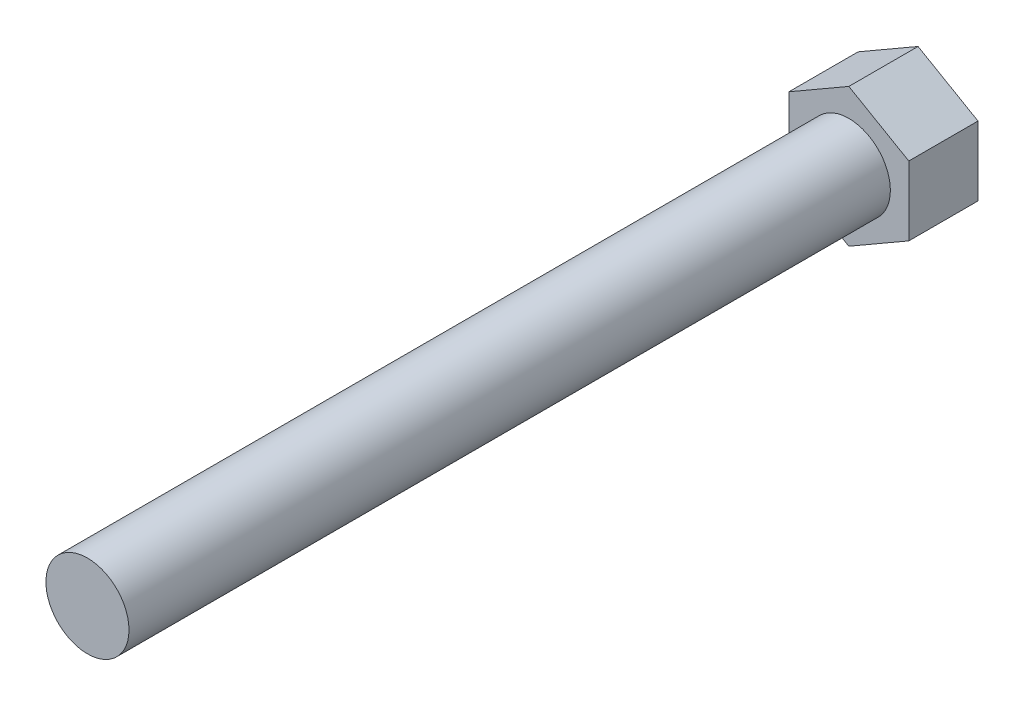
ISO-10303-21;
HEADER;
FILE_DESCRIPTION(('STEP AP214'),'2;1');
FILE_NAME('part.step','',(''),(''),'','','');
FILE_SCHEMA(('AUTOMOTIVE_DESIGN { 1 0 10303 214 1 1 1 1 }'));
ENDSEC;
DATA;
#1=APPLICATION_CONTEXT('core data for automotive mechanical design processes');
#2=APPLICATION_PROTOCOL_DEFINITION('international standard','automotive_design',2000,#1);
#3=PRODUCT_CONTEXT('',#1,'mechanical');
#4=PRODUCT('Part','Part','',(#3));
#5=PRODUCT_RELATED_PRODUCT_CATEGORY('part','',(#4));
#6=PRODUCT_DEFINITION_FORMATION('','',#4);
#7=PRODUCT_DEFINITION_CONTEXT('part definition',#1,'design');
#8=PRODUCT_DEFINITION('design','',#6,#7);
#9=PRODUCT_DEFINITION_SHAPE('','',#8);
#10=(LENGTH_UNIT() NAMED_UNIT(*) SI_UNIT(.MILLI.,.METRE.));
#11=(NAMED_UNIT(*) PLANE_ANGLE_UNIT() SI_UNIT($,.RADIAN.));
#12=(NAMED_UNIT(*) SI_UNIT($,.STERADIAN.) SOLID_ANGLE_UNIT());
#13=UNCERTAINTY_MEASURE_WITH_UNIT(LENGTH_MEASURE(1.E-05),#10,'distance_accuracy_value','');
#14=(GEOMETRIC_REPRESENTATION_CONTEXT(3) GLOBAL_UNCERTAINTY_ASSIGNED_CONTEXT((#13)) GLOBAL_UNIT_ASSIGNED_CONTEXT((#10,
#11,#12)) REPRESENTATION_CONTEXT('',''));
#15=CARTESIAN_POINT('',(0.,0.,0.));
#16=DIRECTION('',(0.,0.,1.));
#17=DIRECTION('',(1.,0.,0.));
#18=AXIS2_PLACEMENT_3D('',#15,#16,#17);
#19=CARTESIAN_POINT('',(8.66025403784431,5.00000000000009,10.));
#20=DIRECTION('',(-0.499999999999995,-0.866025403784441,0.));
#21=DIRECTION('',(0.866025403784441,-0.499999999999995,0.));
#22=AXIS2_PLACEMENT_3D('',#19,#20,#21);
#23=PLANE('',#22);
#24=DIRECTION('',(-0.866025403784441,0.499999999999995,0.));
#25=VECTOR('',#24,1.);
#26=CARTESIAN_POINT('',(8.66025403784431,5.00000000000009,0.));
#27=LINE('',#26,#25);
#28=CARTESIAN_POINT('',(8.66025403784431,5.00000000000009,0.));
#29=VERTEX_POINT('',#28);
#30=CARTESIAN_POINT('',(0.,9.99999999999998,0.));
#31=VERTEX_POINT('',#30);
#32=EDGE_CURVE('E136',#29,#31,#27,.T.);
#33=ORIENTED_EDGE('',*,*,#32,.T.);
#34=DIRECTION('',(0.,0.,-1.));
#35=VECTOR('',#34,1.);
#36=CARTESIAN_POINT('',(0.,9.99999999999998,10.));
#37=LINE('',#36,#35);
#38=CARTESIAN_POINT('',(0.,9.99999999999998,10.));
#39=VERTEX_POINT('',#38);
#40=EDGE_CURVE('E48',#39,#31,#37,.T.);
#41=ORIENTED_EDGE('',*,*,#40,.F.);
#42=DIRECTION('',(-0.866025403784441,0.499999999999995,0.));
#43=VECTOR('',#42,1.);
#44=CARTESIAN_POINT('',(8.66025403784431,5.00000000000009,10.));
#45=LINE('',#44,#43);
#46=CARTESIAN_POINT('',(8.66025403784431,5.00000000000009,10.));
#47=VERTEX_POINT('',#46);
#48=EDGE_CURVE('E153',#47,#39,#45,.T.);
#49=ORIENTED_EDGE('',*,*,#48,.F.);
#50=DIRECTION('',(0.,0.,-1.));
#51=VECTOR('',#50,1.);
#52=CARTESIAN_POINT('',(8.66025403784431,5.00000000000009,10.));
#53=LINE('',#52,#51);
#54=EDGE_CURVE('E132',#47,#29,#53,.T.);
#55=ORIENTED_EDGE('',*,*,#54,.T.);
#56=EDGE_LOOP('',(#33,#41,#49,#55));
#57=FACE_BOUND('',#56,.T.);
#58=ADVANCED_FACE('F45',(#57),#23,.F.);
#59=CARTESIAN_POINT('',(0.,9.99999999999998,10.));
#60=DIRECTION('',(0.500000000000001,-0.866025403784438,0.));
#61=DIRECTION('',(0.866025403784438,0.500000000000001,0.));
#62=AXIS2_PLACEMENT_3D('',#59,#60,#61);
#63=PLANE('',#62);
#64=DIRECTION('',(-0.866025403784438,-0.500000000000001,0.));
#65=VECTOR('',#64,1.);
#66=CARTESIAN_POINT('',(0.,9.99999999999998,0.));
#67=LINE('',#66,#65);
#68=CARTESIAN_POINT('',(-8.66025403784438,4.99999999999997,0.));
#69=VERTEX_POINT('',#68);
#70=EDGE_CURVE('E140',#31,#69,#67,.T.);
#71=ORIENTED_EDGE('',*,*,#70,.T.);
#72=DIRECTION('',(0.,0.,-1.));
#73=VECTOR('',#72,1.);
#74=CARTESIAN_POINT('',(-8.66025403784438,4.99999999999997,10.));
#75=LINE('',#74,#73);
#76=CARTESIAN_POINT('',(-8.66025403784438,4.99999999999997,10.));
#77=VERTEX_POINT('',#76);
#78=EDGE_CURVE('E159',#77,#69,#75,.T.);
#79=ORIENTED_EDGE('',*,*,#78,.F.);
#80=DIRECTION('',(-0.866025403784438,-0.500000000000001,0.));
#81=VECTOR('',#80,1.);
#82=CARTESIAN_POINT('',(0.,9.99999999999998,10.));
#83=LINE('',#82,#81);
#84=EDGE_CURVE('E101',#39,#77,#83,.T.);
#85=ORIENTED_EDGE('',*,*,#84,.F.);
#86=ORIENTED_EDGE('',*,*,#40,.T.);
#87=EDGE_LOOP('',(#71,#79,#85,#86));
#88=FACE_BOUND('',#87,.T.);
#89=ADVANCED_FACE('F166',(#88),#63,.F.);
#90=CARTESIAN_POINT('',(-8.66025403784438,4.99999999999997,10.));
#91=DIRECTION('',(1.,0.,0.));
#92=DIRECTION('',(0.,1.,0.));
#93=AXIS2_PLACEMENT_3D('',#90,#91,#92);
#94=PLANE('',#93);
#95=DIRECTION('',(0.,-1.,0.));
#96=VECTOR('',#95,1.);
#97=CARTESIAN_POINT('',(-8.66025403784438,4.99999999999997,0.));
#98=LINE('',#97,#96);
#99=CARTESIAN_POINT('',(-8.66025403784435,-5.00000000000003,0.));
#100=VERTEX_POINT('',#99);
#101=EDGE_CURVE('E144',#69,#100,#98,.T.);
#102=ORIENTED_EDGE('',*,*,#101,.T.);
#103=DIRECTION('',(0.,0.,-1.));
#104=VECTOR('',#103,1.);
#105=CARTESIAN_POINT('',(-8.66025403784435,-5.00000000000003,10.));
#106=LINE('',#105,#104);
#107=CARTESIAN_POINT('',(-8.66025403784435,-5.00000000000003,10.));
#108=VERTEX_POINT('',#107);
#109=EDGE_CURVE('E125',#108,#100,#106,.T.);
#110=ORIENTED_EDGE('',*,*,#109,.F.);
#111=DIRECTION('',(0.,-1.,0.));
#112=VECTOR('',#111,1.);
#113=CARTESIAN_POINT('',(-8.66025403784438,4.99999999999997,10.));
#114=LINE('',#113,#112);
#115=EDGE_CURVE('E114',#77,#108,#114,.T.);
#116=ORIENTED_EDGE('',*,*,#115,.F.);
#117=ORIENTED_EDGE('',*,*,#78,.T.);
#118=EDGE_LOOP('',(#102,#110,#116,#117));
#119=FACE_BOUND('',#118,.T.);
#120=ADVANCED_FACE('F172',(#119),#94,.F.);
#121=CARTESIAN_POINT('',(-8.66025403784435,-5.00000000000003,10.));
#122=DIRECTION('',(0.499999999999995,0.866025403784442,0.));
#123=DIRECTION('',(-0.866025403784442,0.499999999999995,0.));
#124=AXIS2_PLACEMENT_3D('',#121,#122,#123);
#125=PLANE('',#124);
#126=DIRECTION('',(0.866025403784442,-0.499999999999995,0.));
#127=VECTOR('',#126,1.);
#128=CARTESIAN_POINT('',(-8.66025403784435,-5.00000000000003,0.));
#129=LINE('',#128,#127);
#130=CARTESIAN_POINT('',(0.,-9.99999999999998,0.));
#131=VERTEX_POINT('',#130);
#132=EDGE_CURVE('E123',#100,#131,#129,.T.);
#133=ORIENTED_EDGE('',*,*,#132,.T.);
#134=DIRECTION('',(0.,0.,-1.));
#135=VECTOR('',#134,1.);
#136=CARTESIAN_POINT('',(0.,-9.99999999999998,10.));
#137=LINE('',#136,#135);
#138=CARTESIAN_POINT('',(0.,-9.99999999999998,10.));
#139=VERTEX_POINT('',#138);
#140=EDGE_CURVE('E120',#139,#131,#137,.T.);
#141=ORIENTED_EDGE('',*,*,#140,.F.);
#142=DIRECTION('',(0.866025403784442,-0.499999999999995,0.));
#143=VECTOR('',#142,1.);
#144=CARTESIAN_POINT('',(-8.66025403784435,-5.00000000000003,10.));
#145=LINE('',#144,#143);
#146=EDGE_CURVE('E108',#108,#139,#145,.T.);
#147=ORIENTED_EDGE('',*,*,#146,.F.);
#148=ORIENTED_EDGE('',*,*,#109,.T.);
#149=EDGE_LOOP('',(#133,#141,#147,#148));
#150=FACE_BOUND('',#149,.T.);
#151=ADVANCED_FACE('F121',(#150),#125,.F.);
#152=CARTESIAN_POINT('',(0.,-9.99999999999998,10.));
#153=DIRECTION('',(-0.500000000000007,0.866025403784435,0.));
#154=DIRECTION('',(-0.866025403784435,-0.500000000000007,0.));
#155=AXIS2_PLACEMENT_3D('',#152,#153,#154);
#156=PLANE('',#155);
#157=DIRECTION('',(0.866025403784435,0.500000000000007,0.));
#158=VECTOR('',#157,1.);
#159=CARTESIAN_POINT('',(0.,-9.99999999999998,0.));
#160=LINE('',#159,#158);
#161=CARTESIAN_POINT('',(8.66025403784442,-4.99999999999991,0.));
#162=VERTEX_POINT('',#161);
#163=EDGE_CURVE('E86',#131,#162,#160,.T.);
#164=ORIENTED_EDGE('',*,*,#163,.T.);
#165=DIRECTION('',(0.,0.,-1.));
#166=VECTOR('',#165,1.);
#167=CARTESIAN_POINT('',(8.66025403784442,-4.99999999999991,10.));
#168=LINE('',#167,#166);
#169=CARTESIAN_POINT('',(8.66025403784442,-4.99999999999991,10.));
#170=VERTEX_POINT('',#169);
#171=EDGE_CURVE('E126',#170,#162,#168,.T.);
#172=ORIENTED_EDGE('',*,*,#171,.F.);
#173=DIRECTION('',(0.866025403784435,0.500000000000007,0.));
#174=VECTOR('',#173,1.);
#175=CARTESIAN_POINT('',(0.,-9.99999999999998,10.));
#176=LINE('',#175,#174);
#177=EDGE_CURVE('E112',#139,#170,#176,.T.);
#178=ORIENTED_EDGE('',*,*,#177,.F.);
#179=ORIENTED_EDGE('',*,*,#140,.T.);
#180=EDGE_LOOP('',(#164,#172,#178,#179));
#181=FACE_BOUND('',#180,.T.);
#182=ADVANCED_FACE('F128',(#181),#156,.F.);
#183=CARTESIAN_POINT('',(8.66025403784442,-4.99999999999991,10.));
#184=DIRECTION('',(-1.,0.,0.));
#185=DIRECTION('',(0.,-1.,0.));
#186=AXIS2_PLACEMENT_3D('',#183,#184,#185);
#187=PLANE('',#186);
#188=DIRECTION('',(0.,1.,0.));
#189=VECTOR('',#188,1.);
#190=CARTESIAN_POINT('',(8.66025403784442,-4.99999999999991,0.));
#191=LINE('',#190,#189);
#192=EDGE_CURVE('E92',#162,#29,#191,.T.);
#193=ORIENTED_EDGE('',*,*,#192,.T.);
#194=ORIENTED_EDGE('',*,*,#54,.F.);
#195=DIRECTION('',(0.,1.,0.));
#196=VECTOR('',#195,1.);
#197=CARTESIAN_POINT('',(8.66025403784442,-4.99999999999991,10.));
#198=LINE('',#197,#196);
#199=EDGE_CURVE('E63',#170,#47,#198,.T.);
#200=ORIENTED_EDGE('',*,*,#199,.F.);
#201=ORIENTED_EDGE('',*,*,#171,.T.);
#202=EDGE_LOOP('',(#193,#194,#200,#201));
#203=FACE_BOUND('',#202,.T.);
#204=ADVANCED_FACE('F192',(#203),#187,.F.);
#205=CARTESIAN_POINT('',(0.,0.,10.));
#206=DIRECTION('',(0.,0.,1.));
#207=DIRECTION('',(1.,0.,0.));
#208=AXIS2_PLACEMENT_3D('',#205,#206,#207);
#209=PLANE('',#208);
#210=CARTESIAN_POINT('',(0.,0.,10.));
#211=DIRECTION('',(0.,0.,1.));
#212=DIRECTION('',(1.,0.,0.));
#213=AXIS2_PLACEMENT_3D('',#210,#211,#212);
#214=CIRCLE('',#213,6.);
#215=CARTESIAN_POINT('',(6.,0.,10.));
#216=VERTEX_POINT('',#215);
#217=EDGE_CURVE('E11',#216,#216,#214,.T.);
#218=ORIENTED_EDGE('',*,*,#217,.F.);
#219=EDGE_LOOP('',(#218));
#220=FACE_BOUND('',#219,.T.);
#221=ORIENTED_EDGE('',*,*,#48,.T.);
#222=ORIENTED_EDGE('',*,*,#84,.T.);
#223=ORIENTED_EDGE('',*,*,#115,.T.);
#224=ORIENTED_EDGE('',*,*,#146,.T.);
#225=ORIENTED_EDGE('',*,*,#177,.T.);
#226=ORIENTED_EDGE('',*,*,#199,.T.);
#227=EDGE_LOOP('',(#221,#222,#223,#224,#225,#226));
#228=FACE_BOUND('',#227,.T.);
#229=ADVANCED_FACE('F110',(#220,#228),#209,.T.);
#230=CARTESIAN_POINT('',(0.,0.,0.));
#231=DIRECTION('',(0.,0.,1.));
#232=DIRECTION('',(1.,0.,0.));
#233=AXIS2_PLACEMENT_3D('',#230,#231,#232);
#234=PLANE('',#233);
#235=ORIENTED_EDGE('',*,*,#32,.F.);
#236=ORIENTED_EDGE('',*,*,#192,.F.);
#237=ORIENTED_EDGE('',*,*,#163,.F.);
#238=ORIENTED_EDGE('',*,*,#132,.F.);
#239=ORIENTED_EDGE('',*,*,#101,.F.);
#240=ORIENTED_EDGE('',*,*,#70,.F.);
#241=EDGE_LOOP('',(#235,#236,#237,#238,#239,#240));
#242=FACE_BOUND('',#241,.T.);
#243=ADVANCED_FACE('F171',(#242),#234,.F.);
#244=CARTESIAN_POINT('',(0.,0.,120.));
#245=DIRECTION('',(0.,0.,-1.));
#246=DIRECTION('',(-1.,0.,0.));
#247=AXIS2_PLACEMENT_3D('',#244,#245,#246);
#248=CYLINDRICAL_SURFACE('',#247,6.);
#249=CARTESIAN_POINT('',(0.,0.,120.));
#250=DIRECTION('',(0.,0.,1.));
#251=DIRECTION('',(1.,0.,0.));
#252=AXIS2_PLACEMENT_3D('',#249,#250,#251);
#253=CIRCLE('',#252,6.);
#254=CARTESIAN_POINT('',(6.,0.,120.));
#255=VERTEX_POINT('',#254);
#256=EDGE_CURVE('E141',#255,#255,#253,.T.);
#257=ORIENTED_EDGE('',*,*,#256,.F.);
#258=EDGE_LOOP('',(#257));
#259=FACE_BOUND('',#258,.T.);
#260=ORIENTED_EDGE('',*,*,#217,.T.);
#261=EDGE_LOOP('',(#260));
#262=FACE_BOUND('',#261,.T.);
#263=ADVANCED_FACE('F185',(#259,#262),#248,.T.);
#264=CARTESIAN_POINT('',(0.,0.,120.));
#265=DIRECTION('',(0.,0.,1.));
#266=DIRECTION('',(1.,0.,0.));
#267=AXIS2_PLACEMENT_3D('',#264,#265,#266);
#268=PLANE('',#267);
#269=ORIENTED_EDGE('',*,*,#256,.T.);
#270=EDGE_LOOP('',(#269));
#271=FACE_BOUND('',#270,.T.);
#272=ADVANCED_FACE('F183',(#271),#268,.T.);
#273=CLOSED_SHELL('',(#58,#89,#120,#151,#182,#204,#229,#243,#263,#272));
#274=MANIFOLD_SOLID_BREP('B2',#273);
#275=ADVANCED_BREP_SHAPE_REPRESENTATION('',(#18,#274),#14);
#276=SHAPE_DEFINITION_REPRESENTATION(#9,#275);
ENDSEC;
END-ISO-10303-21;
